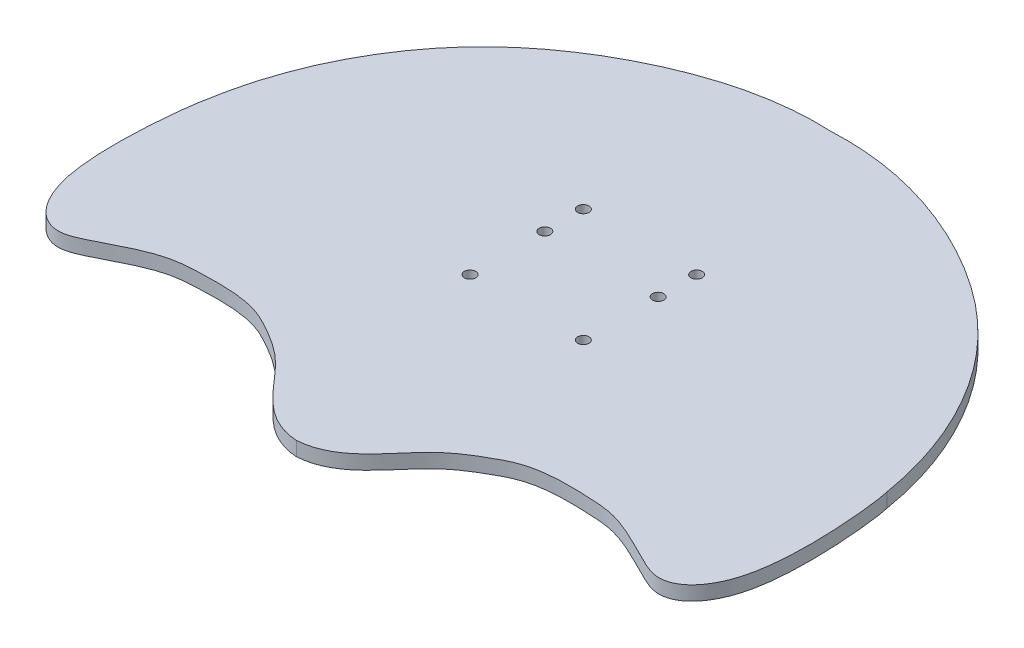
ISO-10303-21;
HEADER;
FILE_DESCRIPTION(('STEP AP214'),'2;1');
FILE_NAME('part.step','',(''),(''),'','','');
FILE_SCHEMA(('AUTOMOTIVE_DESIGN { 1 0 10303 214 1 1 1 1 }'));
ENDSEC;
DATA;
#1=APPLICATION_CONTEXT('core data for automotive mechanical design processes');
#2=APPLICATION_PROTOCOL_DEFINITION('international standard','automotive_design',2000,#1);
#3=PRODUCT_CONTEXT('',#1,'mechanical');
#4=PRODUCT('Part','Part','',(#3));
#5=PRODUCT_RELATED_PRODUCT_CATEGORY('part','',(#4));
#6=PRODUCT_DEFINITION_FORMATION('','',#4);
#7=PRODUCT_DEFINITION_CONTEXT('part definition',#1,'design');
#8=PRODUCT_DEFINITION('design','',#6,#7);
#9=PRODUCT_DEFINITION_SHAPE('','',#8);
#10=(LENGTH_UNIT() NAMED_UNIT(*) SI_UNIT(.MILLI.,.METRE.));
#11=(NAMED_UNIT(*) PLANE_ANGLE_UNIT() SI_UNIT($,.RADIAN.));
#12=(NAMED_UNIT(*) SI_UNIT($,.STERADIAN.) SOLID_ANGLE_UNIT());
#13=UNCERTAINTY_MEASURE_WITH_UNIT(LENGTH_MEASURE(1.E-05),#10,'distance_accuracy_value','');
#14=(GEOMETRIC_REPRESENTATION_CONTEXT(3) GLOBAL_UNCERTAINTY_ASSIGNED_CONTEXT((#13)) GLOBAL_UNIT_ASSIGNED_CONTEXT((#10,
#11,#12)) REPRESENTATION_CONTEXT('',''));
#15=CARTESIAN_POINT('',(0.,0.,0.));
#16=DIRECTION('',(0.,0.,1.));
#17=DIRECTION('',(1.,0.,0.));
#18=AXIS2_PLACEMENT_3D('',#15,#16,#17);
#19=CARTESIAN_POINT('',(-190.5,7.9502,0.));
#20=CARTESIAN_POINT('',(-192.064011792662,7.9502,4.96350192621509));
#21=CARTESIAN_POINT('',(-201.967167765924,7.9502,83.3146183109833));
#22=CARTESIAN_POINT('',(-174.696602041029,7.9502,109.289958804391));
#23=CARTESIAN_POINT('',(-151.630121659032,7.9502,100.567984898405));
#24=CARTESIAN_POINT('',(-131.410771519055,7.9502,87.7197839609674));
#25=CARTESIAN_POINT('',(-96.8435676275136,7.9502,85.3754033772216));
#26=CARTESIAN_POINT('',(-78.6925101438482,7.9502,86.2588274201763));
#27=CARTESIAN_POINT('',(-58.8335330715194,7.9502,96.8793824699203));
#28=CARTESIAN_POINT('',(-37.3059346099107,7.9502,109.935798161985));
#29=CARTESIAN_POINT('',(-21.3496139460233,7.9502,139.114767456721));
#30=CARTESIAN_POINT('',(1.40754784340045E-13,7.9502,140.530090072389));
#31=B_SPLINE_CURVE_WITH_KNOTS('',3,(#19,#20,#21,#22,#23,#24,#25,#26,#27,#28,#29,#30),
.UNSPECIFIED.,.F.,.F.,(4,1,1,1,1,1,1,1,1,4),(0.,0.166997051795611,0.292320514089622,
0.319633117373991,0.426735310498713,0.458914050276757,0.609241775376387,0.641909703937047,
0.766802370245909,1.),.UNSPECIFIED.);
#32=DIRECTION('',(0.,-1.,0.));
#33=VECTOR('',#32,1.);
#34=SURFACE_OF_LINEAR_EXTRUSION('',#31,#33);
#35=CARTESIAN_POINT('',(-190.5,0.,0.));
#36=CARTESIAN_POINT('',(-192.064011792662,0.,4.96350192621509));
#37=CARTESIAN_POINT('',(-201.967167765924,0.,83.3146183109833));
#38=CARTESIAN_POINT('',(-174.696602041029,0.,109.289958804391));
#39=CARTESIAN_POINT('',(-151.630121659032,0.,100.567984898405));
#40=CARTESIAN_POINT('',(-131.410771519055,0.,87.7197839609674));
#41=CARTESIAN_POINT('',(-96.8435676275136,0.,85.3754033772216));
#42=CARTESIAN_POINT('',(-78.6925101438482,0.,86.2588274201763));
#43=CARTESIAN_POINT('',(-58.8335330715194,0.,96.8793824699203));
#44=CARTESIAN_POINT('',(-37.3059346099107,0.,109.935798161985));
#45=CARTESIAN_POINT('',(-21.3496139460233,0.,139.114767456721));
#46=CARTESIAN_POINT('',(1.40754784340045E-13,0.,140.530090072389));
#47=B_SPLINE_CURVE_WITH_KNOTS('',3,(#35,#36,#37,#38,#39,#40,#41,#42,#43,#44,#45,#46),
.UNSPECIFIED.,.F.,.F.,(4,1,1,1,1,1,1,1,1,4),(0.,0.166997051795611,0.292320514089622,
0.319633117373991,0.426735310498713,0.458914050276757,0.609241775376387,0.641909703937047,
0.766802370245909,1.),.UNSPECIFIED.);
#48=CARTESIAN_POINT('',(-190.5,0.,0.));
#49=VERTEX_POINT('',#48);
#50=CARTESIAN_POINT('',(-1.06334839341837E-13,0.,140.530090072389));
#51=VERTEX_POINT('',#50);
#52=EDGE_CURVE('E142',#49,#51,#47,.T.);
#53=ORIENTED_EDGE('',*,*,#52,.T.);
#54=DIRECTION('',(0.,-1.,0.));
#55=VECTOR('',#54,1.);
#56=CARTESIAN_POINT('',(-1.06334839341837E-13,7.9502,140.530090072389));
#57=LINE('',#56,#55);
#58=CARTESIAN_POINT('',(-1.06334839341837E-13,7.9502,140.530090072389));
#59=VERTEX_POINT('',#58);
#60=EDGE_CURVE('E11',#59,#51,#57,.T.);
#61=ORIENTED_EDGE('',*,*,#60,.F.);
#62=CARTESIAN_POINT('',(-190.5,7.9502,0.));
#63=VERTEX_POINT('',#62);
#64=EDGE_CURVE('E100',#63,#59,#31,.T.);
#65=ORIENTED_EDGE('',*,*,#64,.F.);
#66=DIRECTION('',(0.,-1.,0.));
#67=VECTOR('',#66,1.);
#68=CARTESIAN_POINT('',(-190.5,7.9502,0.));
#69=LINE('',#68,#67);
#70=EDGE_CURVE('E113',#63,#49,#69,.T.);
#71=ORIENTED_EDGE('',*,*,#70,.T.);
#72=EDGE_LOOP('',(#53,#61,#65,#71));
#73=FACE_BOUND('',#72,.T.);
#74=ADVANCED_FACE('F47',(#73),#34,.F.);
#75=CARTESIAN_POINT('',(-1.06334839341837E-13,7.9502,140.530090072389));
#76=CARTESIAN_POINT('',(21.3496139460233,7.9502,139.114767456721));
#77=CARTESIAN_POINT('',(37.3059346099107,7.9502,109.935798161984));
#78=CARTESIAN_POINT('',(58.8335330715195,7.9502,96.8793824699203));
#79=CARTESIAN_POINT('',(78.6925101438482,7.9502,86.2588274201763));
#80=CARTESIAN_POINT('',(96.8435676275136,7.9502,85.3754033772216));
#81=CARTESIAN_POINT('',(131.410771519055,7.9502,87.7197839609674));
#82=CARTESIAN_POINT('',(151.630121659032,7.9502,100.567984898405));
#83=CARTESIAN_POINT('',(174.696602041029,7.9502,109.289958804391));
#84=CARTESIAN_POINT('',(201.967167765924,7.9502,83.3146183109832));
#85=CARTESIAN_POINT('',(192.064011792662,7.9502,4.96350192621503));
#86=CARTESIAN_POINT('',(190.5,7.9502,0.));
#87=B_SPLINE_CURVE_WITH_KNOTS('',3,(#75,#76,#77,#78,#79,#80,#81,#82,#83,#84,#85,#86),
.UNSPECIFIED.,.F.,.F.,(4,1,1,1,1,1,1,1,1,4),(0.,0.233197629754091,0.358090296062953,
0.390758224623613,0.541085949723243,0.573264689501287,0.680366882626009,0.707679485910378,
0.833002948204389,1.),.UNSPECIFIED.);
#88=DIRECTION('',(0.,-1.,0.));
#89=VECTOR('',#88,1.);
#90=SURFACE_OF_LINEAR_EXTRUSION('',#87,#89);
#91=CARTESIAN_POINT('',(-1.06334839341837E-13,0.,140.530090072389));
#92=CARTESIAN_POINT('',(21.3496139460233,0.,139.114767456721));
#93=CARTESIAN_POINT('',(37.3059346099107,0.,109.935798161984));
#94=CARTESIAN_POINT('',(58.8335330715195,0.,96.8793824699203));
#95=CARTESIAN_POINT('',(78.6925101438482,0.,86.2588274201763));
#96=CARTESIAN_POINT('',(96.8435676275136,0.,85.3754033772216));
#97=CARTESIAN_POINT('',(131.410771519055,0.,87.7197839609674));
#98=CARTESIAN_POINT('',(151.630121659032,0.,100.567984898405));
#99=CARTESIAN_POINT('',(174.696602041029,0.,109.289958804391));
#100=CARTESIAN_POINT('',(201.967167765924,0.,83.3146183109832));
#101=CARTESIAN_POINT('',(192.064011792662,0.,4.96350192621503));
#102=CARTESIAN_POINT('',(190.5,0.,0.));
#103=B_SPLINE_CURVE_WITH_KNOTS('',3,(#91,#92,#93,#94,#95,#96,#97,#98,#99,#100,#101,#102),
.UNSPECIFIED.,.F.,.F.,(4,1,1,1,1,1,1,1,1,4),(0.,0.233197629754091,0.358090296062953,
0.390758224623613,0.541085949723243,0.573264689501287,0.680366882626009,0.707679485910378,
0.833002948204389,1.),.UNSPECIFIED.);
#104=CARTESIAN_POINT('',(190.5,0.,0.));
#105=VERTEX_POINT('',#104);
#106=EDGE_CURVE('E105',#51,#105,#103,.T.);
#107=ORIENTED_EDGE('',*,*,#106,.T.);
#108=DIRECTION('',(0.,-1.,0.));
#109=VECTOR('',#108,1.);
#110=CARTESIAN_POINT('',(190.5,7.9502,0.));
#111=LINE('',#110,#109);
#112=CARTESIAN_POINT('',(190.5,7.9502,0.));
#113=VERTEX_POINT('',#112);
#114=EDGE_CURVE('E57',#113,#105,#111,.T.);
#115=ORIENTED_EDGE('',*,*,#114,.F.);
#116=EDGE_CURVE('E95',#59,#113,#87,.T.);
#117=ORIENTED_EDGE('',*,*,#116,.F.);
#118=ORIENTED_EDGE('',*,*,#60,.T.);
#119=EDGE_LOOP('',(#107,#115,#117,#118));
#120=FACE_BOUND('',#119,.T.);
#121=ADVANCED_FACE('F104',(#120),#90,.F.);
#122=CARTESIAN_POINT('',(190.5,7.9502,0.));
#123=CARTESIAN_POINT('',(184.392726562295,7.9502,-37.5370382365467));
#124=CARTESIAN_POINT('',(157.261289846749,7.9502,-93.9640934852783));
#125=CARTESIAN_POINT('',(82.3874782016624,7.9502,-146.622658841393));
#126=CARTESIAN_POINT('',(31.3113741429568,7.9502,-160.799884185231));
#127=CARTESIAN_POINT('',(0.,7.9502,-159.189909927611));
#128=B_SPLINE_CURVE_WITH_KNOTS('',3,(#122,#123,#124,#125,#126,#127),.UNSPECIFIED.,.F.,.F.,(4,1,
1,4),(0.,0.424401365551712,0.65636958095173,1.),.UNSPECIFIED.);
#129=DIRECTION('',(0.,-1.,0.));
#130=VECTOR('',#129,1.);
#131=SURFACE_OF_LINEAR_EXTRUSION('',#128,#130);
#132=CARTESIAN_POINT('',(190.5,0.,0.));
#133=CARTESIAN_POINT('',(184.392726562295,0.,-37.5370382365467));
#134=CARTESIAN_POINT('',(157.261289846749,0.,-93.9640934852783));
#135=CARTESIAN_POINT('',(82.3874782016624,0.,-146.622658841393));
#136=CARTESIAN_POINT('',(31.3113741429568,0.,-160.799884185231));
#137=CARTESIAN_POINT('',(0.,0.,-159.189909927611));
#138=B_SPLINE_CURVE_WITH_KNOTS('',3,(#132,#133,#134,#135,#136,#137),.UNSPECIFIED.,.F.,.F.,(4,1,
1,4),(0.,0.424401365551712,0.65636958095173,1.),.UNSPECIFIED.);
#139=CARTESIAN_POINT('',(0.,0.,-159.189909927611));
#140=VERTEX_POINT('',#139);
#141=EDGE_CURVE('E82',#105,#140,#138,.T.);
#142=ORIENTED_EDGE('',*,*,#141,.T.);
#143=DIRECTION('',(0.,-1.,0.));
#144=VECTOR('',#143,1.);
#145=CARTESIAN_POINT('',(0.,7.9502,-159.189909927611));
#146=LINE('',#145,#144);
#147=CARTESIAN_POINT('',(0.,7.9502,-159.189909927611));
#148=VERTEX_POINT('',#147);
#149=EDGE_CURVE('E107',#148,#140,#146,.T.);
#150=ORIENTED_EDGE('',*,*,#149,.F.);
#151=EDGE_CURVE('E98',#113,#148,#128,.T.);
#152=ORIENTED_EDGE('',*,*,#151,.F.);
#153=ORIENTED_EDGE('',*,*,#114,.T.);
#154=EDGE_LOOP('',(#142,#150,#152,#153));
#155=FACE_BOUND('',#154,.T.);
#156=ADVANCED_FACE('F108',(#155),#131,.F.);
#157=CARTESIAN_POINT('',(0.,7.9502,-159.189909927611));
#158=CARTESIAN_POINT('',(-31.3113741429568,7.9502,-160.799884185231));
#159=CARTESIAN_POINT('',(-82.3874782016624,7.9502,-146.622658841393));
#160=CARTESIAN_POINT('',(-157.261289846749,7.9502,-93.9640934852783));
#161=CARTESIAN_POINT('',(-184.392726562295,7.9502,-37.5370382365467));
#162=CARTESIAN_POINT('',(-190.5,7.9502,0.));
#163=B_SPLINE_CURVE_WITH_KNOTS('',3,(#157,#158,#159,#160,#161,#162),.UNSPECIFIED.,.F.,.F.,(4,1,
1,4),(0.,0.34363041904827,0.575598634448288,1.),.UNSPECIFIED.);
#164=DIRECTION('',(0.,-1.,0.));
#165=VECTOR('',#164,1.);
#166=SURFACE_OF_LINEAR_EXTRUSION('',#163,#165);
#167=CARTESIAN_POINT('',(0.,0.,-159.189909927611));
#168=CARTESIAN_POINT('',(-31.3113741429568,0.,-160.799884185231));
#169=CARTESIAN_POINT('',(-82.3874782016624,0.,-146.622658841393));
#170=CARTESIAN_POINT('',(-157.261289846749,0.,-93.9640934852783));
#171=CARTESIAN_POINT('',(-184.392726562295,0.,-37.5370382365467));
#172=CARTESIAN_POINT('',(-190.5,0.,0.));
#173=B_SPLINE_CURVE_WITH_KNOTS('',3,(#167,#168,#169,#170,#171,#172),.UNSPECIFIED.,.F.,.F.,(4,1,
1,4),(0.,0.34363041904827,0.575598634448288,1.),.UNSPECIFIED.);
#174=EDGE_CURVE('E88',#140,#49,#173,.T.);
#175=ORIENTED_EDGE('',*,*,#174,.T.);
#176=ORIENTED_EDGE('',*,*,#70,.F.);
#177=EDGE_CURVE('E65',#148,#63,#163,.T.);
#178=ORIENTED_EDGE('',*,*,#177,.F.);
#179=ORIENTED_EDGE('',*,*,#149,.T.);
#180=EDGE_LOOP('',(#175,#176,#178,#179));
#181=FACE_BOUND('',#180,.T.);
#182=ADVANCED_FACE('F131',(#181),#166,.F.);
#183=CARTESIAN_POINT('',(-98.1259130559372,7.9502,86.0527308590208));
#184=DIRECTION('',(0.,-1.,0.));
#185=DIRECTION('',(0.,0.,-1.));
#186=AXIS2_PLACEMENT_3D('',#183,#184,#185);
#187=PLANE('',#186);
#188=CARTESIAN_POINT('',(31.75,7.9502,-52.07));
#189=DIRECTION('',(0.,-1.,0.));
#190=DIRECTION('',(0.,0.,-1.));
#191=AXIS2_PLACEMENT_3D('',#188,#189,#190);
#192=CIRCLE('',#191,3.175);
#193=CARTESIAN_POINT('',(31.75,7.9502,-55.245));
#194=VERTEX_POINT('',#193);
#195=EDGE_CURVE('E221',#194,#194,#192,.T.);
#196=ORIENTED_EDGE('',*,*,#195,.T.);
#197=EDGE_LOOP('',(#196));
#198=FACE_BOUND('',#197,.T.);
#199=CARTESIAN_POINT('',(-31.75,7.9502,-52.07));
#200=DIRECTION('',(0.,-1.,0.));
#201=DIRECTION('',(0.,0.,-1.));
#202=AXIS2_PLACEMENT_3D('',#199,#200,#201);
#203=CIRCLE('',#202,3.175);
#204=CARTESIAN_POINT('',(-31.75,7.9502,-55.245));
#205=VERTEX_POINT('',#204);
#206=EDGE_CURVE('E234',#205,#205,#203,.T.);
#207=ORIENTED_EDGE('',*,*,#206,.T.);
#208=EDGE_LOOP('',(#207));
#209=FACE_BOUND('',#208,.T.);
#210=CARTESIAN_POINT('',(-31.75,7.9502,11.43));
#211=DIRECTION('',(0.,-1.,0.));
#212=DIRECTION('',(0.,0.,-1.));
#213=AXIS2_PLACEMENT_3D('',#210,#211,#212);
#214=CIRCLE('',#213,3.175);
#215=CARTESIAN_POINT('',(-31.75,7.9502,8.255));
#216=VERTEX_POINT('',#215);
#217=EDGE_CURVE('E242',#216,#216,#214,.T.);
#218=ORIENTED_EDGE('',*,*,#217,.T.);
#219=EDGE_LOOP('',(#218));
#220=FACE_BOUND('',#219,.T.);
#221=CARTESIAN_POINT('',(31.75,7.9502,11.43));
#222=DIRECTION('',(0.,-1.,0.));
#223=DIRECTION('',(0.,0.,-1.));
#224=AXIS2_PLACEMENT_3D('',#221,#222,#223);
#225=CIRCLE('',#224,3.175);
#226=CARTESIAN_POINT('',(31.75,7.9502,8.25500000000001));
#227=VERTEX_POINT('',#226);
#228=EDGE_CURVE('E250',#227,#227,#225,.T.);
#229=ORIENTED_EDGE('',*,*,#228,.T.);
#230=EDGE_LOOP('',(#229));
#231=FACE_BOUND('',#230,.T.);
#232=CARTESIAN_POINT('',(31.75,7.9502,-30.48));
#233=DIRECTION('',(0.,-1.,0.));
#234=DIRECTION('',(0.,0.,-1.));
#235=AXIS2_PLACEMENT_3D('',#232,#233,#234);
#236=CIRCLE('',#235,3.175);
#237=CARTESIAN_POINT('',(31.75,7.9502,-33.655));
#238=VERTEX_POINT('',#237);
#239=EDGE_CURVE('E258',#238,#238,#236,.T.);
#240=ORIENTED_EDGE('',*,*,#239,.T.);
#241=EDGE_LOOP('',(#240));
#242=FACE_BOUND('',#241,.T.);
#243=CARTESIAN_POINT('',(-31.75,7.9502,-30.48));
#244=DIRECTION('',(0.,-1.,0.));
#245=DIRECTION('',(0.,0.,-1.));
#246=AXIS2_PLACEMENT_3D('',#243,#244,#245);
#247=CIRCLE('',#246,3.175);
#248=CARTESIAN_POINT('',(-31.75,7.9502,-33.655));
#249=VERTEX_POINT('',#248);
#250=EDGE_CURVE('E145',#249,#249,#247,.T.);
#251=ORIENTED_EDGE('',*,*,#250,.T.);
#252=EDGE_LOOP('',(#251));
#253=FACE_BOUND('',#252,.T.);
#254=ORIENTED_EDGE('',*,*,#64,.T.);
#255=ORIENTED_EDGE('',*,*,#116,.T.);
#256=ORIENTED_EDGE('',*,*,#151,.T.);
#257=ORIENTED_EDGE('',*,*,#177,.T.);
#258=EDGE_LOOP('',(#254,#255,#256,#257));
#259=FACE_BOUND('',#258,.T.);
#260=ADVANCED_FACE('F96',(#198,#209,#220,#231,#242,#253,#259),#187,.F.);
#261=CARTESIAN_POINT('',(-98.1259130559372,0.,86.0527308590208));
#262=DIRECTION('',(0.,-1.,0.));
#263=DIRECTION('',(0.,0.,-1.));
#264=AXIS2_PLACEMENT_3D('',#261,#262,#263);
#265=PLANE('',#264);
#266=CARTESIAN_POINT('',(31.75,0.,-52.07));
#267=DIRECTION('',(0.,-1.,0.));
#268=DIRECTION('',(0.,0.,-1.));
#269=AXIS2_PLACEMENT_3D('',#266,#267,#268);
#270=CIRCLE('',#269,3.175);
#271=CARTESIAN_POINT('',(31.75,0.,-55.245));
#272=VERTEX_POINT('',#271);
#273=EDGE_CURVE('E223',#272,#272,#270,.T.);
#274=ORIENTED_EDGE('',*,*,#273,.F.);
#275=EDGE_LOOP('',(#274));
#276=FACE_BOUND('',#275,.T.);
#277=CARTESIAN_POINT('',(-31.75,0.,-52.07));
#278=DIRECTION('',(0.,-1.,0.));
#279=DIRECTION('',(0.,0.,-1.));
#280=AXIS2_PLACEMENT_3D('',#277,#278,#279);
#281=CIRCLE('',#280,3.175);
#282=CARTESIAN_POINT('',(-31.75,0.,-55.245));
#283=VERTEX_POINT('',#282);
#284=EDGE_CURVE('E228',#283,#283,#281,.T.);
#285=ORIENTED_EDGE('',*,*,#284,.F.);
#286=EDGE_LOOP('',(#285));
#287=FACE_BOUND('',#286,.T.);
#288=CARTESIAN_POINT('',(-31.75,0.,11.43));
#289=DIRECTION('',(0.,-1.,0.));
#290=DIRECTION('',(0.,0.,-1.));
#291=AXIS2_PLACEMENT_3D('',#288,#289,#290);
#292=CIRCLE('',#291,3.175);
#293=CARTESIAN_POINT('',(-31.75,0.,8.255));
#294=VERTEX_POINT('',#293);
#295=EDGE_CURVE('E238',#294,#294,#292,.T.);
#296=ORIENTED_EDGE('',*,*,#295,.F.);
#297=EDGE_LOOP('',(#296));
#298=FACE_BOUND('',#297,.T.);
#299=CARTESIAN_POINT('',(31.75,0.,11.43));
#300=DIRECTION('',(0.,-1.,0.));
#301=DIRECTION('',(0.,0.,-1.));
#302=AXIS2_PLACEMENT_3D('',#299,#300,#301);
#303=CIRCLE('',#302,3.175);
#304=CARTESIAN_POINT('',(31.75,0.,8.25500000000001));
#305=VERTEX_POINT('',#304);
#306=EDGE_CURVE('E246',#305,#305,#303,.T.);
#307=ORIENTED_EDGE('',*,*,#306,.F.);
#308=EDGE_LOOP('',(#307));
#309=FACE_BOUND('',#308,.T.);
#310=CARTESIAN_POINT('',(31.75,0.,-30.48));
#311=DIRECTION('',(0.,-1.,0.));
#312=DIRECTION('',(0.,0.,-1.));
#313=AXIS2_PLACEMENT_3D('',#310,#311,#312);
#314=CIRCLE('',#313,3.175);
#315=CARTESIAN_POINT('',(31.75,0.,-33.655));
#316=VERTEX_POINT('',#315);
#317=EDGE_CURVE('E254',#316,#316,#314,.T.);
#318=ORIENTED_EDGE('',*,*,#317,.F.);
#319=EDGE_LOOP('',(#318));
#320=FACE_BOUND('',#319,.T.);
#321=CARTESIAN_POINT('',(-31.75,0.,-30.48));
#322=DIRECTION('',(0.,-1.,0.));
#323=DIRECTION('',(0.,0.,-1.));
#324=AXIS2_PLACEMENT_3D('',#321,#322,#323);
#325=CIRCLE('',#324,3.175);
#326=CARTESIAN_POINT('',(-31.75,0.,-33.655));
#327=VERTEX_POINT('',#326);
#328=EDGE_CURVE('E151',#327,#327,#325,.T.);
#329=ORIENTED_EDGE('',*,*,#328,.F.);
#330=EDGE_LOOP('',(#329));
#331=FACE_BOUND('',#330,.T.);
#332=ORIENTED_EDGE('',*,*,#52,.F.);
#333=ORIENTED_EDGE('',*,*,#174,.F.);
#334=ORIENTED_EDGE('',*,*,#141,.F.);
#335=ORIENTED_EDGE('',*,*,#106,.F.);
#336=EDGE_LOOP('',(#332,#333,#334,#335));
#337=FACE_BOUND('',#336,.T.);
#338=ADVANCED_FACE('F182',(#276,#287,#298,#309,#320,#331,#337),#265,.T.);
#339=CARTESIAN_POINT('',(-31.75,0.,-30.48));
#340=DIRECTION('',(0.,-1.,0.));
#341=DIRECTION('',(0.,0.,-1.));
#342=AXIS2_PLACEMENT_3D('',#339,#340,#341);
#343=CYLINDRICAL_SURFACE('',#342,3.175);
#344=ORIENTED_EDGE('',*,*,#250,.F.);
#345=EDGE_LOOP('',(#344));
#346=FACE_BOUND('',#345,.T.);
#347=ORIENTED_EDGE('',*,*,#328,.T.);
#348=EDGE_LOOP('',(#347));
#349=FACE_BOUND('',#348,.T.);
#350=ADVANCED_FACE('F184',(#346,#349),#343,.F.);
#351=CARTESIAN_POINT('',(31.75,0.,-30.48));
#352=DIRECTION('',(0.,-1.,0.));
#353=DIRECTION('',(0.,0.,-1.));
#354=AXIS2_PLACEMENT_3D('',#351,#352,#353);
#355=CYLINDRICAL_SURFACE('',#354,3.175);
#356=ORIENTED_EDGE('',*,*,#239,.F.);
#357=EDGE_LOOP('',(#356));
#358=FACE_BOUND('',#357,.T.);
#359=ORIENTED_EDGE('',*,*,#317,.T.);
#360=EDGE_LOOP('',(#359));
#361=FACE_BOUND('',#360,.T.);
#362=ADVANCED_FACE('F190',(#358,#361),#355,.F.);
#363=CARTESIAN_POINT('',(31.75,0.,11.43));
#364=DIRECTION('',(0.,-1.,0.));
#365=DIRECTION('',(0.,0.,-1.));
#366=AXIS2_PLACEMENT_3D('',#363,#364,#365);
#367=CYLINDRICAL_SURFACE('',#366,3.175);
#368=ORIENTED_EDGE('',*,*,#228,.F.);
#369=EDGE_LOOP('',(#368));
#370=FACE_BOUND('',#369,.T.);
#371=ORIENTED_EDGE('',*,*,#306,.T.);
#372=EDGE_LOOP('',(#371));
#373=FACE_BOUND('',#372,.T.);
#374=ADVANCED_FACE('F200',(#370,#373),#367,.F.);
#375=CARTESIAN_POINT('',(-31.75,0.,11.43));
#376=DIRECTION('',(0.,-1.,0.));
#377=DIRECTION('',(0.,0.,-1.));
#378=AXIS2_PLACEMENT_3D('',#375,#376,#377);
#379=CYLINDRICAL_SURFACE('',#378,3.175);
#380=ORIENTED_EDGE('',*,*,#217,.F.);
#381=EDGE_LOOP('',(#380));
#382=FACE_BOUND('',#381,.T.);
#383=ORIENTED_EDGE('',*,*,#295,.T.);
#384=EDGE_LOOP('',(#383));
#385=FACE_BOUND('',#384,.T.);
#386=ADVANCED_FACE('F204',(#382,#385),#379,.F.);
#387=CARTESIAN_POINT('',(-31.75,0.,-52.07));
#388=DIRECTION('',(0.,-1.,0.));
#389=DIRECTION('',(0.,0.,-1.));
#390=AXIS2_PLACEMENT_3D('',#387,#388,#389);
#391=CYLINDRICAL_SURFACE('',#390,3.175);
#392=ORIENTED_EDGE('',*,*,#206,.F.);
#393=EDGE_LOOP('',(#392));
#394=FACE_BOUND('',#393,.T.);
#395=ORIENTED_EDGE('',*,*,#284,.T.);
#396=EDGE_LOOP('',(#395));
#397=FACE_BOUND('',#396,.T.);
#398=ADVANCED_FACE('F208',(#394,#397),#391,.F.);
#399=CARTESIAN_POINT('',(31.75,0.,-52.07));
#400=DIRECTION('',(0.,-1.,0.));
#401=DIRECTION('',(0.,0.,-1.));
#402=AXIS2_PLACEMENT_3D('',#399,#400,#401);
#403=CYLINDRICAL_SURFACE('',#402,3.175);
#404=ORIENTED_EDGE('',*,*,#195,.F.);
#405=EDGE_LOOP('',(#404));
#406=FACE_BOUND('',#405,.T.);
#407=ORIENTED_EDGE('',*,*,#273,.T.);
#408=EDGE_LOOP('',(#407));
#409=FACE_BOUND('',#408,.T.);
#410=ADVANCED_FACE('F212',(#406,#409),#403,.F.);
#411=CLOSED_SHELL('',(#74,#121,#156,#182,#260,#338,#350,#362,#374,#386,#398,#410));
#412=MANIFOLD_SOLID_BREP('B2',#411);
#413=ADVANCED_BREP_SHAPE_REPRESENTATION('',(#18,#412),#14);
#414=SHAPE_DEFINITION_REPRESENTATION(#9,#413);
ENDSEC;
END-ISO-10303-21;
